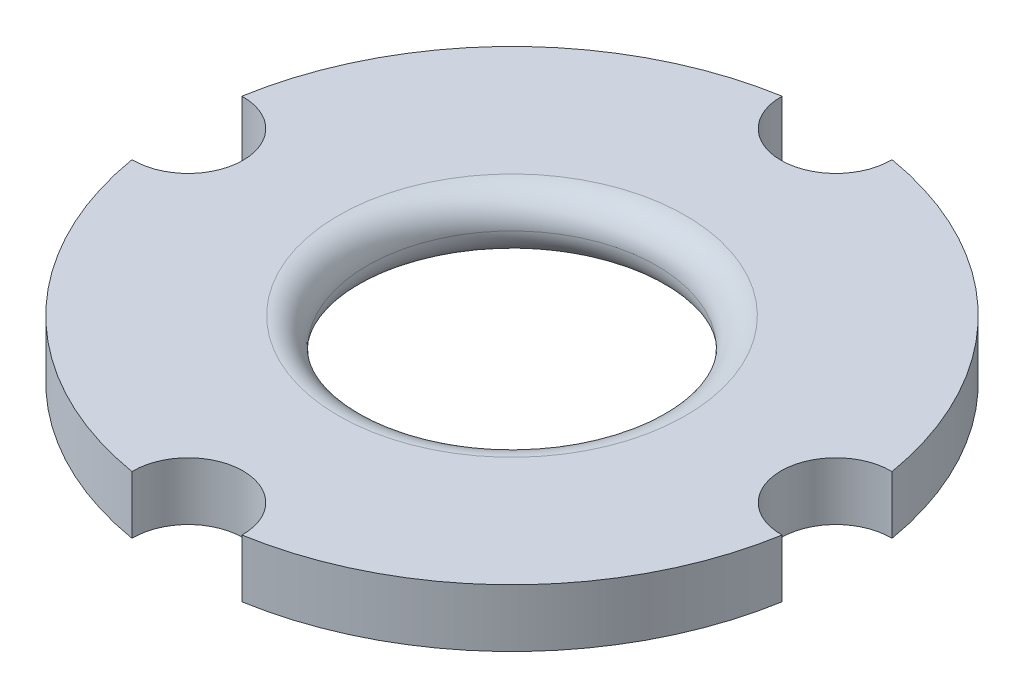
ISO-10303-21;
HEADER;
FILE_DESCRIPTION(('STEP AP214'),'2;1');
FILE_NAME('part.step','',(''),(''),'','','');
FILE_SCHEMA(('AUTOMOTIVE_DESIGN { 1 0 10303 214 1 1 1 1 }'));
ENDSEC;
DATA;
#1=APPLICATION_CONTEXT('core data for automotive mechanical design processes');
#2=APPLICATION_PROTOCOL_DEFINITION('international standard','automotive_design',2000,#1);
#3=PRODUCT_CONTEXT('',#1,'mechanical');
#4=PRODUCT('Part','Part','',(#3));
#5=PRODUCT_RELATED_PRODUCT_CATEGORY('part','',(#4));
#6=PRODUCT_DEFINITION_FORMATION('','',#4);
#7=PRODUCT_DEFINITION_CONTEXT('part definition',#1,'design');
#8=PRODUCT_DEFINITION('design','',#6,#7);
#9=PRODUCT_DEFINITION_SHAPE('','',#8);
#10=(LENGTH_UNIT() NAMED_UNIT(*) SI_UNIT(.MILLI.,.METRE.));
#11=(NAMED_UNIT(*) PLANE_ANGLE_UNIT() SI_UNIT($,.RADIAN.));
#12=(NAMED_UNIT(*) SI_UNIT($,.STERADIAN.) SOLID_ANGLE_UNIT());
#13=UNCERTAINTY_MEASURE_WITH_UNIT(LENGTH_MEASURE(1.E-05),#10,'distance_accuracy_value','');
#14=(GEOMETRIC_REPRESENTATION_CONTEXT(3) GLOBAL_UNCERTAINTY_ASSIGNED_CONTEXT((#13)) GLOBAL_UNIT_ASSIGNED_CONTEXT((#10,
#11,#12)) REPRESENTATION_CONTEXT('',''));
#15=CARTESIAN_POINT('',(0.,0.,0.));
#16=DIRECTION('',(0.,0.,1.));
#17=DIRECTION('',(1.,0.,0.));
#18=AXIS2_PLACEMENT_3D('',#15,#16,#17);
#19=CARTESIAN_POINT('',(0.,2.,0.));
#20=DIRECTION('',(0.,1.,0.));
#21=DIRECTION('',(0.,0.,1.));
#22=AXIS2_PLACEMENT_3D('',#19,#20,#21);
#23=PLANE('',#22);
#24=CARTESIAN_POINT('',(0.,2.,0.));
#25=DIRECTION('',(0.,1.,0.));
#26=DIRECTION('',(0.,0.,1.));
#27=AXIS2_PLACEMENT_3D('',#24,#25,#26);
#28=CIRCLE('',#27,6.);
#29=CARTESIAN_POINT('',(0.,2.,6.));
#30=VERTEX_POINT('',#29);
#31=EDGE_CURVE('E168',#30,#30,#28,.F.);
#32=ORIENTED_EDGE('',*,*,#31,.T.);
#33=EDGE_LOOP('',(#32));
#34=FACE_BOUND('',#33,.T.);
#35=CARTESIAN_POINT('',(0.,2.,11.2));
#36=DIRECTION('',(0.,1.,0.));
#37=DIRECTION('',(0.,0.,-1.));
#38=AXIS2_PLACEMENT_3D('',#35,#36,#37);
#39=CIRCLE('',#38,1.9);
#40=CARTESIAN_POINT('',(1.89956563702732,2.,11.240625));
#41=VERTEX_POINT('',#40);
#42=CARTESIAN_POINT('',(-1.89956563702732,2.,11.240625));
#43=VERTEX_POINT('',#42);
#44=EDGE_CURVE('E130',#41,#43,#39,.T.);
#45=ORIENTED_EDGE('',*,*,#44,.F.);
#46=CARTESIAN_POINT('',(0.,2.,0.));
#47=DIRECTION('',(0.,1.,0.));
#48=DIRECTION('',(0.,0.,1.));
#49=AXIS2_PLACEMENT_3D('',#46,#47,#48);
#50=CIRCLE('',#49,11.4);
#51=CARTESIAN_POINT('',(11.240625,2.,1.89956563702736));
#52=VERTEX_POINT('',#51);
#53=EDGE_CURVE('E111',#41,#52,#50,.T.);
#54=ORIENTED_EDGE('',*,*,#53,.T.);
#55=CARTESIAN_POINT('',(11.2,2.,0.));
#56=DIRECTION('',(0.,1.,0.));
#57=DIRECTION('',(-1.,0.,0.));
#58=AXIS2_PLACEMENT_3D('',#55,#56,#57);
#59=CIRCLE('',#58,1.9);
#60=CARTESIAN_POINT('',(11.240625,2.,-1.89956563702728));
#61=VERTEX_POINT('',#60);
#62=EDGE_CURVE('E144',#61,#52,#59,.T.);
#63=ORIENTED_EDGE('',*,*,#62,.F.);
#64=CARTESIAN_POINT('',(1.89956563702732,2.,-11.240625));
#65=VERTEX_POINT('',#64);
#66=EDGE_CURVE('E123',#61,#65,#50,.T.);
#67=ORIENTED_EDGE('',*,*,#66,.T.);
#68=CARTESIAN_POINT('',(0.,2.,-11.2));
#69=DIRECTION('',(0.,1.,0.));
#70=DIRECTION('',(0.,0.,1.));
#71=AXIS2_PLACEMENT_3D('',#68,#69,#70);
#72=CIRCLE('',#71,1.9);
#73=CARTESIAN_POINT('',(-1.89956563702732,2.,-11.240625));
#74=VERTEX_POINT('',#73);
#75=EDGE_CURVE('E160',#74,#65,#72,.T.);
#76=ORIENTED_EDGE('',*,*,#75,.F.);
#77=CARTESIAN_POINT('',(-11.240625,2.,-1.89956563702744));
#78=VERTEX_POINT('',#77);
#79=EDGE_CURVE('E216',#74,#78,#50,.T.);
#80=ORIENTED_EDGE('',*,*,#79,.T.);
#81=CARTESIAN_POINT('',(-11.2,2.,-1.17313772985129E-13));
#82=DIRECTION('',(0.,1.,0.));
#83=DIRECTION('',(1.,0.,0.));
#84=AXIS2_PLACEMENT_3D('',#81,#82,#83);
#85=CIRCLE('',#84,1.9);
#86=CARTESIAN_POINT('',(-11.240625,2.,1.8995656370272));
#87=VERTEX_POINT('',#86);
#88=EDGE_CURVE('E147',#87,#78,#85,.T.);
#89=ORIENTED_EDGE('',*,*,#88,.F.);
#90=EDGE_CURVE('E125',#87,#43,#50,.T.);
#91=ORIENTED_EDGE('',*,*,#90,.T.);
#92=EDGE_LOOP('',(#45,#54,#63,#67,#76,#80,#89,#91));
#93=FACE_BOUND('',#92,.T.);
#94=ADVANCED_FACE('F47',(#34,#93),#23,.T.);
#95=CARTESIAN_POINT('',(0.,0.,0.));
#96=DIRECTION('',(0.,1.,0.));
#97=DIRECTION('',(0.,0.,1.));
#98=AXIS2_PLACEMENT_3D('',#95,#96,#97);
#99=PLANE('',#98);
#100=CARTESIAN_POINT('',(0.,0.,0.));
#101=DIRECTION('',(0.,1.,0.));
#102=DIRECTION('',(0.,0.,1.));
#103=AXIS2_PLACEMENT_3D('',#100,#101,#102);
#104=CIRCLE('',#103,6.);
#105=CARTESIAN_POINT('',(0.,0.,6.));
#106=VERTEX_POINT('',#105);
#107=EDGE_CURVE('E159',#106,#106,#104,.T.);
#108=ORIENTED_EDGE('',*,*,#107,.T.);
#109=EDGE_LOOP('',(#108));
#110=FACE_BOUND('',#109,.T.);
#111=CARTESIAN_POINT('',(0.,0.,0.));
#112=DIRECTION('',(0.,1.,0.));
#113=DIRECTION('',(0.,0.,1.));
#114=AXIS2_PLACEMENT_3D('',#111,#112,#113);
#115=CIRCLE('',#114,11.4);
#116=CARTESIAN_POINT('',(1.89956563702732,0.,11.240625));
#117=VERTEX_POINT('',#116);
#118=CARTESIAN_POINT('',(11.240625,0.,1.89956563702736));
#119=VERTEX_POINT('',#118);
#120=EDGE_CURVE('E135',#117,#119,#115,.T.);
#121=ORIENTED_EDGE('',*,*,#120,.F.);
#122=CARTESIAN_POINT('',(0.,0.,11.2));
#123=DIRECTION('',(0.,1.,0.));
#124=DIRECTION('',(0.,0.,-1.));
#125=AXIS2_PLACEMENT_3D('',#122,#123,#124);
#126=CIRCLE('',#125,1.9);
#127=CARTESIAN_POINT('',(-1.89956563702732,0.,11.240625));
#128=VERTEX_POINT('',#127);
#129=EDGE_CURVE('E132',#117,#128,#126,.T.);
#130=ORIENTED_EDGE('',*,*,#129,.T.);
#131=CARTESIAN_POINT('',(-11.240625,0.,1.8995656370272));
#132=VERTEX_POINT('',#131);
#133=EDGE_CURVE('E71',#132,#128,#115,.T.);
#134=ORIENTED_EDGE('',*,*,#133,.F.);
#135=CARTESIAN_POINT('',(-11.2,0.,-1.17313772985129E-13));
#136=DIRECTION('',(0.,1.,0.));
#137=DIRECTION('',(1.,0.,0.));
#138=AXIS2_PLACEMENT_3D('',#135,#136,#137);
#139=CIRCLE('',#138,1.9);
#140=CARTESIAN_POINT('',(-11.240625,0.,-1.89956563702744));
#141=VERTEX_POINT('',#140);
#142=EDGE_CURVE('E140',#132,#141,#139,.T.);
#143=ORIENTED_EDGE('',*,*,#142,.T.);
#144=CARTESIAN_POINT('',(-1.89956563702732,0.,-11.240625));
#145=VERTEX_POINT('',#144);
#146=EDGE_CURVE('E63',#145,#141,#115,.T.);
#147=ORIENTED_EDGE('',*,*,#146,.F.);
#148=CARTESIAN_POINT('',(0.,0.,-11.2));
#149=DIRECTION('',(0.,1.,0.));
#150=DIRECTION('',(0.,0.,1.));
#151=AXIS2_PLACEMENT_3D('',#148,#149,#150);
#152=CIRCLE('',#151,1.9);
#153=CARTESIAN_POINT('',(1.89956563702732,0.,-11.240625));
#154=VERTEX_POINT('',#153);
#155=EDGE_CURVE('E155',#145,#154,#152,.T.);
#156=ORIENTED_EDGE('',*,*,#155,.T.);
#157=CARTESIAN_POINT('',(11.240625,0.,-1.89956563702728));
#158=VERTEX_POINT('',#157);
#159=EDGE_CURVE('E122',#158,#154,#115,.T.);
#160=ORIENTED_EDGE('',*,*,#159,.F.);
#161=CARTESIAN_POINT('',(11.2,0.,0.));
#162=DIRECTION('',(0.,1.,0.));
#163=DIRECTION('',(-1.,0.,0.));
#164=AXIS2_PLACEMENT_3D('',#161,#162,#163);
#165=CIRCLE('',#164,1.9);
#166=EDGE_CURVE('E164',#158,#119,#165,.T.);
#167=ORIENTED_EDGE('',*,*,#166,.T.);
#168=EDGE_LOOP('',(#121,#130,#134,#143,#147,#156,#160,#167));
#169=FACE_BOUND('',#168,.T.);
#170=ADVANCED_FACE('F186',(#110,#169),#99,.F.);
#171=CARTESIAN_POINT('',(0.,0.,-11.2));
#172=DIRECTION('',(0.,1.,0.));
#173=DIRECTION('',(0.,0.,1.));
#174=AXIS2_PLACEMENT_3D('',#171,#172,#173);
#175=CYLINDRICAL_SURFACE('',#174,1.9);
#176=DIRECTION('',(0.,1.,0.));
#177=VECTOR('',#176,1.);
#178=CARTESIAN_POINT('',(1.89956563702732,-3.,-11.240625));
#179=LINE('',#178,#177);
#180=EDGE_CURVE('E189',#154,#65,#179,.T.);
#181=ORIENTED_EDGE('',*,*,#180,.F.);
#182=ORIENTED_EDGE('',*,*,#155,.F.);
#183=DIRECTION('',(0.,1.,0.));
#184=VECTOR('',#183,1.);
#185=CARTESIAN_POINT('',(-1.89956563702732,-3.,-11.240625));
#186=LINE('',#185,#184);
#187=EDGE_CURVE('E174',#74,#145,#186,.F.);
#188=ORIENTED_EDGE('',*,*,#187,.F.);
#189=ORIENTED_EDGE('',*,*,#75,.T.);
#190=EDGE_LOOP('',(#181,#182,#188,#189));
#191=FACE_BOUND('',#190,.T.);
#192=ADVANCED_FACE('F223',(#191),#175,.F.);
#193=CARTESIAN_POINT('',(-11.2,0.,-1.17313772985129E-13));
#194=DIRECTION('',(0.,1.,0.));
#195=DIRECTION('',(0.,0.,1.));
#196=AXIS2_PLACEMENT_3D('',#193,#194,#195);
#197=CYLINDRICAL_SURFACE('',#196,1.9);
#198=DIRECTION('',(0.,1.,0.));
#199=VECTOR('',#198,1.);
#200=CARTESIAN_POINT('',(-11.240625,-3.,-1.89956563702744));
#201=LINE('',#200,#199);
#202=EDGE_CURVE('E198',#141,#78,#201,.T.);
#203=ORIENTED_EDGE('',*,*,#202,.F.);
#204=ORIENTED_EDGE('',*,*,#142,.F.);
#205=DIRECTION('',(0.,1.,0.));
#206=VECTOR('',#205,1.);
#207=CARTESIAN_POINT('',(-11.240625,-3.,1.8995656370272));
#208=LINE('',#207,#206);
#209=EDGE_CURVE('E201',#87,#132,#208,.F.);
#210=ORIENTED_EDGE('',*,*,#209,.F.);
#211=ORIENTED_EDGE('',*,*,#88,.T.);
#212=EDGE_LOOP('',(#203,#204,#210,#211));
#213=FACE_BOUND('',#212,.T.);
#214=ADVANCED_FACE('F213',(#213),#197,.F.);
#215=CARTESIAN_POINT('',(0.,0.,11.2));
#216=DIRECTION('',(0.,1.,0.));
#217=DIRECTION('',(0.,0.,1.));
#218=AXIS2_PLACEMENT_3D('',#215,#216,#217);
#219=CYLINDRICAL_SURFACE('',#218,1.9);
#220=DIRECTION('',(0.,1.,0.));
#221=VECTOR('',#220,1.);
#222=CARTESIAN_POINT('',(-1.89956563702732,-3.,11.240625));
#223=LINE('',#222,#221);
#224=EDGE_CURVE('E134',#128,#43,#223,.T.);
#225=ORIENTED_EDGE('',*,*,#224,.F.);
#226=ORIENTED_EDGE('',*,*,#129,.F.);
#227=DIRECTION('',(0.,1.,0.));
#228=VECTOR('',#227,1.);
#229=CARTESIAN_POINT('',(1.89956563702732,-3.,11.240625));
#230=LINE('',#229,#228);
#231=EDGE_CURVE('E114',#41,#117,#230,.F.);
#232=ORIENTED_EDGE('',*,*,#231,.F.);
#233=ORIENTED_EDGE('',*,*,#44,.T.);
#234=EDGE_LOOP('',(#225,#226,#232,#233));
#235=FACE_BOUND('',#234,.T.);
#236=ADVANCED_FACE('F129',(#235),#219,.F.);
#237=CARTESIAN_POINT('',(11.2,0.,0.));
#238=DIRECTION('',(0.,1.,0.));
#239=DIRECTION('',(0.,0.,1.));
#240=AXIS2_PLACEMENT_3D('',#237,#238,#239);
#241=CYLINDRICAL_SURFACE('',#240,1.9);
#242=DIRECTION('',(0.,1.,0.));
#243=VECTOR('',#242,1.);
#244=CARTESIAN_POINT('',(11.240625,-3.,1.89956563702736));
#245=LINE('',#244,#243);
#246=EDGE_CURVE('E11',#119,#52,#245,.T.);
#247=ORIENTED_EDGE('',*,*,#246,.F.);
#248=ORIENTED_EDGE('',*,*,#166,.F.);
#249=DIRECTION('',(0.,1.,0.));
#250=VECTOR('',#249,1.);
#251=CARTESIAN_POINT('',(11.240625,-3.,-1.89956563702728));
#252=LINE('',#251,#250);
#253=EDGE_CURVE('E56',#61,#158,#252,.F.);
#254=ORIENTED_EDGE('',*,*,#253,.F.);
#255=ORIENTED_EDGE('',*,*,#62,.T.);
#256=EDGE_LOOP('',(#247,#248,#254,#255));
#257=FACE_BOUND('',#256,.T.);
#258=ADVANCED_FACE('F191',(#257),#241,.F.);
#259=CARTESIAN_POINT('',(0.,1.,0.));
#260=DIRECTION('',(0.,1.,0.));
#261=DIRECTION('',(0.,0.,1.));
#262=AXIS2_PLACEMENT_3D('',#259,#260,#261);
#263=TOROIDAL_SURFACE('',#262,6.,1.);
#264=ORIENTED_EDGE('',*,*,#31,.F.);
#265=EDGE_LOOP('',(#264));
#266=FACE_BOUND('',#265,.T.);
#267=CARTESIAN_POINT('',(0.,1.,0.));
#268=DIRECTION('',(0.,1.,0.));
#269=DIRECTION('',(0.,0.,1.));
#270=AXIS2_PLACEMENT_3D('',#267,#268,#269);
#271=CIRCLE('',#270,5.);
#272=CARTESIAN_POINT('',(0.,1.,5.));
#273=VERTEX_POINT('',#272);
#274=EDGE_CURVE('E154',#273,#273,#271,.T.);
#275=ORIENTED_EDGE('',*,*,#274,.F.);
#276=EDGE_LOOP('',(#275));
#277=FACE_BOUND('',#276,.T.);
#278=ADVANCED_FACE('F49',(#266,#277),#263,.T.);
#279=CARTESIAN_POINT('',(0.,1.,0.));
#280=DIRECTION('',(0.,1.,0.));
#281=DIRECTION('',(0.,0.,1.));
#282=AXIS2_PLACEMENT_3D('',#279,#280,#281);
#283=TOROIDAL_SURFACE('',#282,6.,1.);
#284=ORIENTED_EDGE('',*,*,#274,.T.);
#285=EDGE_LOOP('',(#284));
#286=FACE_BOUND('',#285,.T.);
#287=ORIENTED_EDGE('',*,*,#107,.F.);
#288=EDGE_LOOP('',(#287));
#289=FACE_BOUND('',#288,.T.);
#290=ADVANCED_FACE('F239',(#286,#289),#283,.T.);
#291=CARTESIAN_POINT('',(0.,-8.,0.));
#292=DIRECTION('',(0.,1.,0.));
#293=DIRECTION('',(0.,0.,1.));
#294=AXIS2_PLACEMENT_3D('',#291,#292,#293);
#295=CYLINDRICAL_SURFACE('',#294,11.4);
#296=ORIENTED_EDGE('',*,*,#180,.T.);
#297=ORIENTED_EDGE('',*,*,#66,.F.);
#298=ORIENTED_EDGE('',*,*,#253,.T.);
#299=ORIENTED_EDGE('',*,*,#159,.T.);
#300=EDGE_LOOP('',(#296,#297,#298,#299));
#301=FACE_BOUND('',#300,.T.);
#302=ADVANCED_FACE('F179',(#301),#295,.T.);
#303=ORIENTED_EDGE('',*,*,#231,.T.);
#304=ORIENTED_EDGE('',*,*,#120,.T.);
#305=ORIENTED_EDGE('',*,*,#246,.T.);
#306=ORIENTED_EDGE('',*,*,#53,.F.);
#307=EDGE_LOOP('',(#303,#304,#305,#306));
#308=FACE_BOUND('',#307,.T.);
#309=ADVANCED_FACE('F113',(#308),#295,.T.);
#310=ORIENTED_EDGE('',*,*,#209,.T.);
#311=ORIENTED_EDGE('',*,*,#133,.T.);
#312=ORIENTED_EDGE('',*,*,#224,.T.);
#313=ORIENTED_EDGE('',*,*,#90,.F.);
#314=EDGE_LOOP('',(#310,#311,#312,#313));
#315=FACE_BOUND('',#314,.T.);
#316=ADVANCED_FACE('F261',(#315),#295,.T.);
#317=ORIENTED_EDGE('',*,*,#187,.T.);
#318=ORIENTED_EDGE('',*,*,#146,.T.);
#319=ORIENTED_EDGE('',*,*,#202,.T.);
#320=ORIENTED_EDGE('',*,*,#79,.F.);
#321=EDGE_LOOP('',(#317,#318,#319,#320));
#322=FACE_BOUND('',#321,.T.);
#323=ADVANCED_FACE('F215',(#322),#295,.T.);
#324=CLOSED_SHELL('',(#94,#170,#192,#214,#236,#258,#278,#290,#302,#309,#316,#323));
#325=MANIFOLD_SOLID_BREP('B2',#324);
#326=ADVANCED_BREP_SHAPE_REPRESENTATION('',(#18,#325),#14);
#327=SHAPE_DEFINITION_REPRESENTATION(#9,#326);
ENDSEC;
END-ISO-10303-21;
